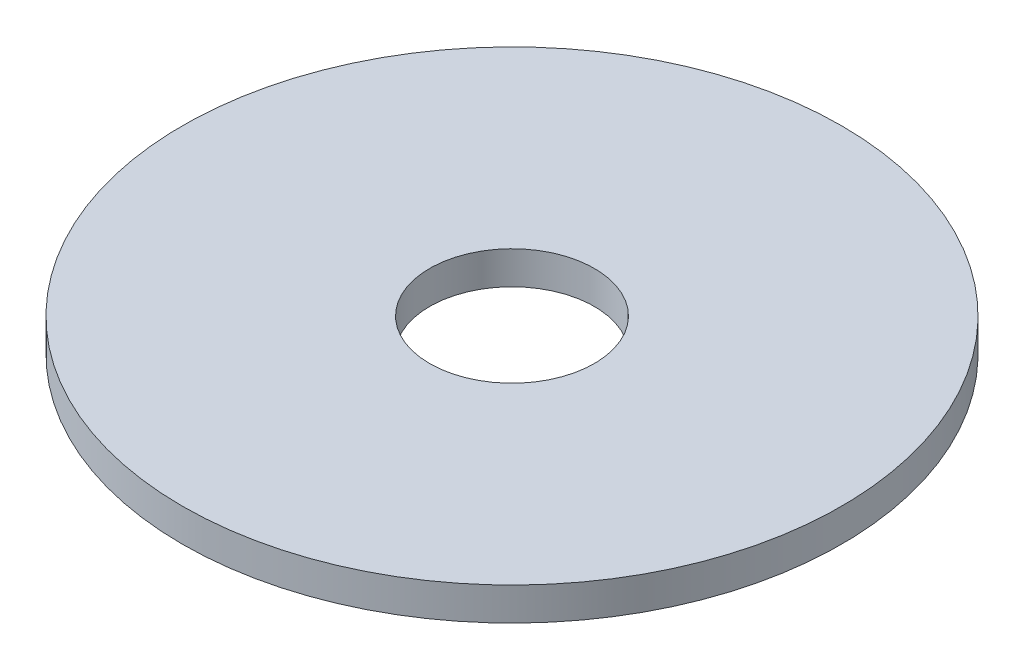
ISO-10303-21;
HEADER;
FILE_DESCRIPTION(('STEP AP214'),'2;1');
FILE_NAME('part.step','',(''),(''),'','','');
FILE_SCHEMA(('AUTOMOTIVE_DESIGN { 1 0 10303 214 1 1 1 1 }'));
ENDSEC;
DATA;
#1=APPLICATION_CONTEXT('core data for automotive mechanical design processes');
#2=APPLICATION_PROTOCOL_DEFINITION('international standard','automotive_design',2000,#1);
#3=PRODUCT_CONTEXT('',#1,'mechanical');
#4=PRODUCT('Part','Part','',(#3));
#5=PRODUCT_RELATED_PRODUCT_CATEGORY('part','',(#4));
#6=PRODUCT_DEFINITION_FORMATION('','',#4);
#7=PRODUCT_DEFINITION_CONTEXT('part definition',#1,'design');
#8=PRODUCT_DEFINITION('design','',#6,#7);
#9=PRODUCT_DEFINITION_SHAPE('','',#8);
#10=(LENGTH_UNIT() NAMED_UNIT(*) SI_UNIT(.MILLI.,.METRE.));
#11=(NAMED_UNIT(*) PLANE_ANGLE_UNIT() SI_UNIT($,.RADIAN.));
#12=(NAMED_UNIT(*) SI_UNIT($,.STERADIAN.) SOLID_ANGLE_UNIT());
#13=UNCERTAINTY_MEASURE_WITH_UNIT(LENGTH_MEASURE(1.E-05),#10,'distance_accuracy_value','');
#14=(GEOMETRIC_REPRESENTATION_CONTEXT(3) GLOBAL_UNCERTAINTY_ASSIGNED_CONTEXT((#13)) GLOBAL_UNIT_ASSIGNED_CONTEXT((#10,
#11,#12)) REPRESENTATION_CONTEXT('',''));
#15=CARTESIAN_POINT('',(0.,0.,0.));
#16=DIRECTION('',(0.,0.,1.));
#17=DIRECTION('',(1.,0.,0.));
#18=AXIS2_PLACEMENT_3D('',#15,#16,#17);
#19=CARTESIAN_POINT('',(0.,1.,0.));
#20=DIRECTION('',(0.,1.,0.));
#21=DIRECTION('',(0.,0.,1.));
#22=AXIS2_PLACEMENT_3D('',#19,#20,#21);
#23=PLANE('',#22);
#24=CARTESIAN_POINT('',(0.,1.,0.));
#25=DIRECTION('',(0.,1.,0.));
#26=DIRECTION('',(0.,0.,1.));
#27=AXIS2_PLACEMENT_3D('',#24,#25,#26);
#28=CIRCLE('',#27,10.);
#29=CARTESIAN_POINT('',(0.,1.,10.));
#30=VERTEX_POINT('',#29);
#31=EDGE_CURVE('E10',#30,#30,#28,.T.);
#32=ORIENTED_EDGE('',*,*,#31,.T.);
#33=EDGE_LOOP('',(#32));
#34=FACE_BOUND('',#33,.T.);
#35=CARTESIAN_POINT('',(0.,1.,0.));
#36=DIRECTION('',(0.,1.,0.));
#37=DIRECTION('',(0.,0.,1.));
#38=AXIS2_PLACEMENT_3D('',#35,#36,#37);
#39=CIRCLE('',#38,2.5);
#40=CARTESIAN_POINT('',(0.,1.,2.5));
#41=VERTEX_POINT('',#40);
#42=EDGE_CURVE('E54',#41,#41,#39,.T.);
#43=ORIENTED_EDGE('',*,*,#42,.F.);
#44=EDGE_LOOP('',(#43));
#45=FACE_BOUND('',#44,.T.);
#46=ADVANCED_FACE('F41',(#34,#45),#23,.T.);
#47=CARTESIAN_POINT('',(0.,0.,0.));
#48=DIRECTION('',(0.,1.,0.));
#49=DIRECTION('',(0.,0.,1.));
#50=AXIS2_PLACEMENT_3D('',#47,#48,#49);
#51=PLANE('',#50);
#52=CARTESIAN_POINT('',(0.,0.,0.));
#53=DIRECTION('',(0.,1.,0.));
#54=DIRECTION('',(0.,0.,1.));
#55=AXIS2_PLACEMENT_3D('',#52,#53,#54);
#56=CIRCLE('',#55,10.);
#57=CARTESIAN_POINT('',(0.,0.,10.));
#58=VERTEX_POINT('',#57);
#59=EDGE_CURVE('E45',#58,#58,#56,.T.);
#60=ORIENTED_EDGE('',*,*,#59,.F.);
#61=EDGE_LOOP('',(#60));
#62=FACE_BOUND('',#61,.T.);
#63=CARTESIAN_POINT('',(0.,0.,0.));
#64=DIRECTION('',(0.,1.,0.));
#65=DIRECTION('',(0.,0.,1.));
#66=AXIS2_PLACEMENT_3D('',#63,#64,#65);
#67=CIRCLE('',#66,2.5);
#68=CARTESIAN_POINT('',(0.,0.,2.5));
#69=VERTEX_POINT('',#68);
#70=EDGE_CURVE('E56',#69,#69,#67,.T.);
#71=ORIENTED_EDGE('',*,*,#70,.T.);
#72=EDGE_LOOP('',(#71));
#73=FACE_BOUND('',#72,.T.);
#74=ADVANCED_FACE('F68',(#62,#73),#51,.F.);
#75=CARTESIAN_POINT('',(0.,1.,0.));
#76=DIRECTION('',(0.,-1.,0.));
#77=DIRECTION('',(0.,0.,-1.));
#78=AXIS2_PLACEMENT_3D('',#75,#76,#77);
#79=CYLINDRICAL_SURFACE('',#78,10.);
#80=ORIENTED_EDGE('',*,*,#31,.F.);
#81=EDGE_LOOP('',(#80));
#82=FACE_BOUND('',#81,.T.);
#83=ORIENTED_EDGE('',*,*,#59,.T.);
#84=EDGE_LOOP('',(#83));
#85=FACE_BOUND('',#84,.T.);
#86=ADVANCED_FACE('F43',(#82,#85),#79,.T.);
#87=CARTESIAN_POINT('',(0.,1.,0.));
#88=DIRECTION('',(0.,-1.,0.));
#89=DIRECTION('',(0.,0.,-1.));
#90=AXIS2_PLACEMENT_3D('',#87,#88,#89);
#91=CYLINDRICAL_SURFACE('',#90,2.5);
#92=ORIENTED_EDGE('',*,*,#42,.T.);
#93=EDGE_LOOP('',(#92));
#94=FACE_BOUND('',#93,.T.);
#95=ORIENTED_EDGE('',*,*,#70,.F.);
#96=EDGE_LOOP('',(#95));
#97=FACE_BOUND('',#96,.T.);
#98=ADVANCED_FACE('F64',(#94,#97),#91,.F.);
#99=CLOSED_SHELL('',(#46,#74,#86,#98));
#100=MANIFOLD_SOLID_BREP('B2',#99);
#101=ADVANCED_BREP_SHAPE_REPRESENTATION('',(#18,#100),#14);
#102=SHAPE_DEFINITION_REPRESENTATION(#9,#101);
ENDSEC;
END-ISO-10303-21;
